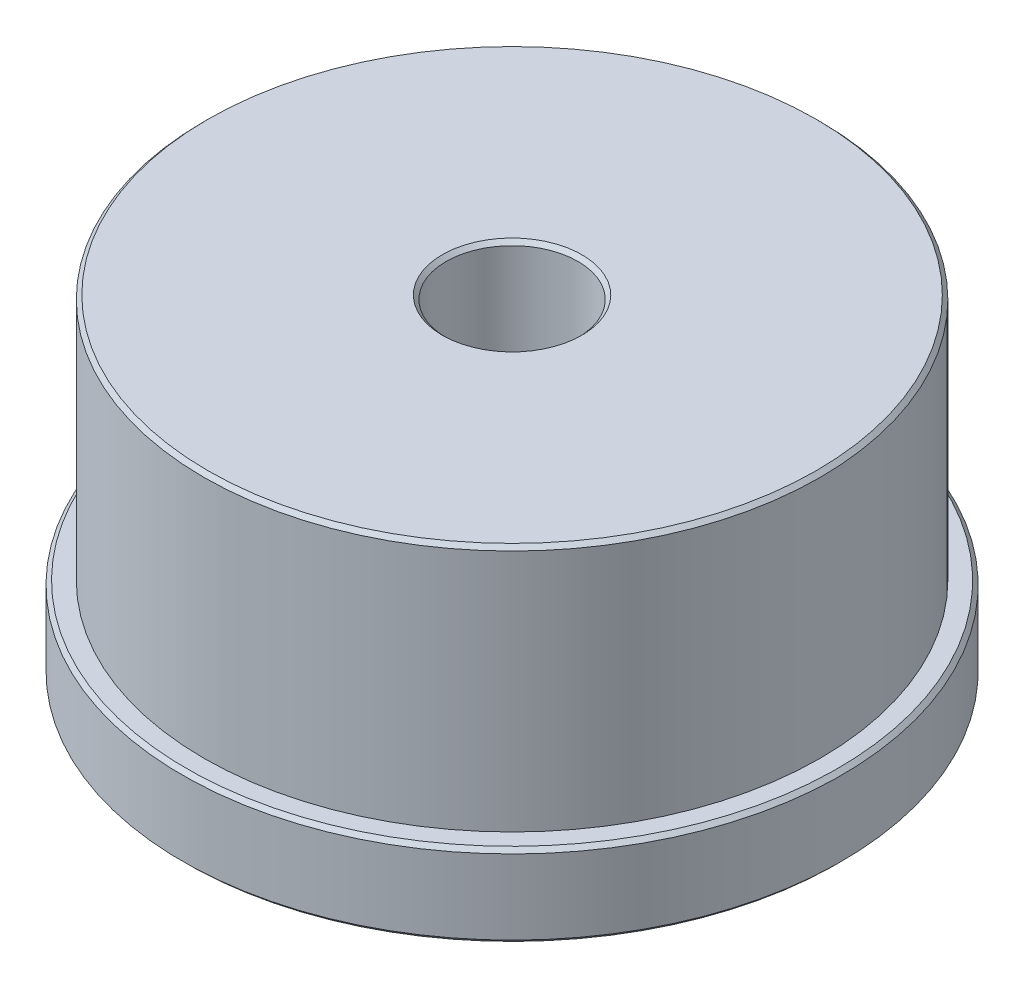
ISO-10303-21;
HEADER;
FILE_DESCRIPTION(('STEP AP214'),'2;1');
FILE_NAME('part.step','',(''),(''),'','','');
FILE_SCHEMA(('AUTOMOTIVE_DESIGN { 1 0 10303 214 1 1 1 1 }'));
ENDSEC;
DATA;
#1=APPLICATION_CONTEXT('core data for automotive mechanical design processes');
#2=APPLICATION_PROTOCOL_DEFINITION('international standard','automotive_design',2000,#1);
#3=PRODUCT_CONTEXT('',#1,'mechanical');
#4=PRODUCT('Part','Part','',(#3));
#5=PRODUCT_RELATED_PRODUCT_CATEGORY('part','',(#4));
#6=PRODUCT_DEFINITION_FORMATION('','',#4);
#7=PRODUCT_DEFINITION_CONTEXT('part definition',#1,'design');
#8=PRODUCT_DEFINITION('design','',#6,#7);
#9=PRODUCT_DEFINITION_SHAPE('','',#8);
#10=(LENGTH_UNIT() NAMED_UNIT(*) SI_UNIT(.MILLI.,.METRE.));
#11=(NAMED_UNIT(*) PLANE_ANGLE_UNIT() SI_UNIT($,.RADIAN.));
#12=(NAMED_UNIT(*) SI_UNIT($,.STERADIAN.) SOLID_ANGLE_UNIT());
#13=UNCERTAINTY_MEASURE_WITH_UNIT(LENGTH_MEASURE(1.E-05),#10,'distance_accuracy_value','');
#14=(GEOMETRIC_REPRESENTATION_CONTEXT(3) GLOBAL_UNCERTAINTY_ASSIGNED_CONTEXT((#13)) GLOBAL_UNIT_ASSIGNED_CONTEXT((#10,
#11,#12)) REPRESENTATION_CONTEXT('',''));
#15=CARTESIAN_POINT('',(0.,0.,0.));
#16=DIRECTION('',(0.,0.,1.));
#17=DIRECTION('',(1.,0.,0.));
#18=AXIS2_PLACEMENT_3D('',#15,#16,#17);
#19=CARTESIAN_POINT('',(0.,19.05,0.));
#20=DIRECTION('',(0.,-1.,0.));
#21=DIRECTION('',(0.,0.,-1.));
#22=AXIS2_PLACEMENT_3D('',#19,#20,#21);
#23=CYLINDRICAL_SURFACE('',#22,5.08);
#24=CARTESIAN_POINT('',(0.,-0.512800091999992,0.));
#25=DIRECTION('',(0.,-1.,0.));
#26=DIRECTION('',(0.,0.,-1.));
#27=AXIS2_PLACEMENT_3D('',#24,#25,#26);
#28=CIRCLE('',#27,5.08);
#29=CARTESIAN_POINT('',(0.,-0.512800091999992,-5.08));
#30=VERTEX_POINT('',#29);
#31=EDGE_CURVE('E76',#30,#30,#28,.T.);
#32=ORIENTED_EDGE('',*,*,#31,.T.);
#33=EDGE_LOOP('',(#32));
#34=FACE_BOUND('',#33,.T.);
#35=CARTESIAN_POINT('',(0.,18.750000092,0.));
#36=DIRECTION('',(0.,1.,0.));
#37=DIRECTION('',(0.,0.,1.));
#38=AXIS2_PLACEMENT_3D('',#35,#36,#37);
#39=CIRCLE('',#38,5.08);
#40=CARTESIAN_POINT('',(0.,18.750000092,5.08));
#41=VERTEX_POINT('',#40);
#42=EDGE_CURVE('E79',#41,#41,#39,.T.);
#43=ORIENTED_EDGE('',*,*,#42,.T.);
#44=EDGE_LOOP('',(#43));
#45=FACE_BOUND('',#44,.T.);
#46=ADVANCED_FACE('F40',(#34,#45),#23,.F.);
#47=CARTESIAN_POINT('',(0.,19.05,0.));
#48=DIRECTION('',(0.,-1.,0.));
#49=DIRECTION('',(0.,0.,-1.));
#50=AXIS2_PLACEMENT_3D('',#47,#48,#49);
#51=CYLINDRICAL_SURFACE('',#50,23.749);
#52=CARTESIAN_POINT('',(0.,18.750000092,0.));
#53=DIRECTION('',(0.,1.,0.));
#54=DIRECTION('',(0.,0.,1.));
#55=AXIS2_PLACEMENT_3D('',#52,#53,#54);
#56=CIRCLE('',#55,23.749);
#57=CARTESIAN_POINT('',(0.,18.750000092,-23.749));
#58=VERTEX_POINT('',#57);
#59=EDGE_CURVE('E10',#58,#58,#56,.F.);
#60=CARTESIAN_POINT('',(0.,0.,0.));
#61=DIRECTION('',(0.,1.,0.));
#62=DIRECTION('',(0.,0.,1.));
#63=AXIS2_PLACEMENT_3D('',#60,#61,#62);
#64=CIRCLE('',#63,23.749);
#65=CARTESIAN_POINT('',(0.,0.,-23.749));
#66=VERTEX_POINT('',#65);
#67=EDGE_CURVE('E85',#66,#66,#64,.T.);
#68=CARTESIAN_POINT('',(0.,18.750000092,-23.749));
#69=CARTESIAN_POINT('',(0.,18.5546875910417,-23.749));
#70=CARTESIAN_POINT('',(0.,18.3593750900834,-23.749));
#71=CARTESIAN_POINT('',(0.,17.9687500881667,-23.749));
#72=CARTESIAN_POINT('',(0.,17.7734375872084,-23.749));
#73=CARTESIAN_POINT('',(0.,17.3828125852917,-23.749));
#74=CARTESIAN_POINT('',(0.,17.1875000843334,-23.749));
#75=CARTESIAN_POINT('',(0.,16.7968750824167,-23.749));
#76=CARTESIAN_POINT('',(0.,16.6015625814584,-23.749));
#77=CARTESIAN_POINT('',(0.,16.2109375795417,-23.749));
#78=CARTESIAN_POINT('',(0.,16.0156250785834,-23.749));
#79=CARTESIAN_POINT('',(0.,15.6250000766667,-23.749));
#80=CARTESIAN_POINT('',(0.,15.4296875757084,-23.749));
#81=CARTESIAN_POINT('',(0.,15.0390625737917,-23.749));
#82=CARTESIAN_POINT('',(0.,14.8437500728334,-23.749));
#83=CARTESIAN_POINT('',(0.,14.4531250709167,-23.749));
#84=CARTESIAN_POINT('',(0.,14.2578125699584,-23.749));
#85=CARTESIAN_POINT('',(0.,13.8671875680417,-23.749));
#86=CARTESIAN_POINT('',(0.,13.6718750670834,-23.749));
#87=CARTESIAN_POINT('',(0.,13.2812500651667,-23.749));
#88=CARTESIAN_POINT('',(0.,13.0859375642084,-23.749));
#89=CARTESIAN_POINT('',(0.,12.6953125622917,-23.749));
#90=CARTESIAN_POINT('',(0.,12.5000000613334,-23.749));
#91=CARTESIAN_POINT('',(0.,12.1093750594167,-23.749));
#92=CARTESIAN_POINT('',(0.,11.9140625584584,-23.749));
#93=CARTESIAN_POINT('',(0.,11.5234375565417,-23.749));
#94=CARTESIAN_POINT('',(0.,11.3281250555834,-23.749));
#95=CARTESIAN_POINT('',(0.,10.9375000536667,-23.749));
#96=CARTESIAN_POINT('',(0.,10.7421875527084,-23.749));
#97=CARTESIAN_POINT('',(0.,10.3515625507917,-23.749));
#98=CARTESIAN_POINT('',(0.,10.1562500498334,-23.749));
#99=CARTESIAN_POINT('',(0.,9.76562504791669,-23.749));
#100=CARTESIAN_POINT('',(0.,9.57031254695835,-23.749));
#101=CARTESIAN_POINT('',(0.,9.17968754504168,-23.749));
#102=CARTESIAN_POINT('',(0.,8.98437504408335,-23.749));
#103=CARTESIAN_POINT('',(0.,8.59375004216668,-23.749));
#104=CARTESIAN_POINT('',(0.,8.39843754120835,-23.749));
#105=CARTESIAN_POINT('',(0.,8.00781253929168,-23.749));
#106=CARTESIAN_POINT('',(0.,7.81250003833335,-23.749));
#107=CARTESIAN_POINT('',(0.,7.42187503641668,-23.749));
#108=CARTESIAN_POINT('',(0.,7.22656253545835,-23.749));
#109=CARTESIAN_POINT('',(0.,6.83593753354168,-23.749));
#110=CARTESIAN_POINT('',(0.,6.64062503258335,-23.749));
#111=CARTESIAN_POINT('',(0.,6.25000003066668,-23.749));
#112=CARTESIAN_POINT('',(0.,6.05468752970834,-23.749));
#113=CARTESIAN_POINT('',(0.,5.66406252779168,-23.749));
#114=CARTESIAN_POINT('',(0.,5.46875002683334,-23.749));
#115=CARTESIAN_POINT('',(0.,5.07812502491667,-23.749));
#116=CARTESIAN_POINT('',(0.,4.88281252395834,-23.749));
#117=CARTESIAN_POINT('',(0.,4.49218752204167,-23.749));
#118=CARTESIAN_POINT('',(0.,4.29687502108334,-23.749));
#119=CARTESIAN_POINT('',(0.,3.90625001916667,-23.749));
#120=CARTESIAN_POINT('',(0.,3.71093751820834,-23.749));
#121=CARTESIAN_POINT('',(0.,3.32031251629167,-23.749));
#122=CARTESIAN_POINT('',(0.,3.12500001533334,-23.749));
#123=CARTESIAN_POINT('',(0.,2.73437501341667,-23.749));
#124=CARTESIAN_POINT('',(0.,2.53906251245834,-23.749));
#125=CARTESIAN_POINT('',(0.,2.14843751054167,-23.749));
#126=CARTESIAN_POINT('',(0.,1.95312500958333,-23.749));
#127=CARTESIAN_POINT('',(0.,1.56250000766667,-23.749));
#128=CARTESIAN_POINT('',(0.,1.36718750670833,-23.749));
#129=CARTESIAN_POINT('',(0.,0.976562504791667,-23.749));
#130=CARTESIAN_POINT('',(0.,0.781250003833334,-23.749));
#131=CARTESIAN_POINT('',(0.,0.390625001916667,-23.749));
#132=CARTESIAN_POINT('',(0.,0.195312500958334,-23.749));
#133=CARTESIAN_POINT('',(0.,0.,-23.749));
#134=B_SPLINE_CURVE_WITH_KNOTS('',3,(#68,#69,#70,#71,#72,#73,#74,#75,#76,#77,#78,#79,#80,#81,
#82,#83,#84,#85,#86,#87,#88,#89,#90,#91,#92,#93,#94,#95,#96,#97,#98,#99,#100,#101,#102,#103,
#104,#105,#106,#107,#108,#109,#110,#111,#112,#113,#114,#115,#116,#117,#118,#119,#120,#121,#122,
#123,#124,#125,#126,#127,#128,#129,#130,#131,#132,#133),.UNSPECIFIED.,.F.,.F.,(4,2,2,2,2,2,2,2,
2,2,2,2,2,2,2,2,2,2,2,2,2,2,2,2,2,2,2,2,2,2,2,2,4),(0.,0.585937502875004,1.17187500575,
1.757812508625,2.34375001150001,2.92968751437501,3.51562501725001,4.10156252012501,
4.68750002300001,5.27343752587501,5.85937502875001,6.44531253162502,7.03125003450002,
7.61718753737502,8.20312504025002,8.78906254312502,9.37500004600002,9.96093754887502,
10.54687505175,11.132812554625,11.7187500575,12.304687560375,12.89062506325,13.476562566125,
14.062500069,14.648437571875,15.23437507475,15.820312577625,16.4062500805,16.992187583375,
17.57812508625,18.164062589125,18.750000092),.UNSPECIFIED.);
#135=EDGE_CURVE('BSEAM111',#58,#66,#134,.T.);
#136=ORIENTED_EDGE('',*,*,#59,.T.);
#137=ORIENTED_EDGE('',*,*,#67,.T.);
#138=ORIENTED_EDGE('',*,*,#135,.T.);
#139=ORIENTED_EDGE('',*,*,#135,.F.);
#140=EDGE_LOOP('',(#136,#138,#137,#139));
#141=FACE_BOUND('',#140,.T.);
#142=ADVANCED_FACE('F111',(#141),#51,.T.);
#143=CARTESIAN_POINT('',(0.,19.05,0.));
#144=DIRECTION('',(0.,1.,0.));
#145=DIRECTION('',(0.,0.,1.));
#146=AXIS2_PLACEMENT_3D('',#143,#144,#145);
#147=PLANE('',#146);
#148=CARTESIAN_POINT('',(0.,19.05,0.));
#149=DIRECTION('',(0.,1.,0.));
#150=DIRECTION('',(0.,0.,1.));
#151=AXIS2_PLACEMENT_3D('',#148,#149,#150);
#152=CIRCLE('',#151,23.449000092);
#153=CARTESIAN_POINT('',(0.,19.05,-23.449000092));
#154=VERTEX_POINT('',#153);
#155=EDGE_CURVE('E48',#154,#154,#152,.T.);
#156=ORIENTED_EDGE('',*,*,#155,.T.);
#157=EDGE_LOOP('',(#156));
#158=FACE_BOUND('',#157,.T.);
#159=CARTESIAN_POINT('',(0.,19.05,0.));
#160=DIRECTION('',(0.,1.,0.));
#161=DIRECTION('',(0.,0.,1.));
#162=AXIS2_PLACEMENT_3D('',#159,#160,#161);
#163=CIRCLE('',#162,5.379999908);
#164=CARTESIAN_POINT('',(0.,19.05,5.379999908));
#165=VERTEX_POINT('',#164);
#166=EDGE_CURVE('E52',#165,#165,#163,.F.);
#167=ORIENTED_EDGE('',*,*,#166,.T.);
#168=EDGE_LOOP('',(#167));
#169=FACE_BOUND('',#168,.T.);
#170=ADVANCED_FACE('F116',(#158,#169),#147,.T.);
#171=CARTESIAN_POINT('',(0.,-6.35,0.));
#172=DIRECTION('',(0.,1.,0.));
#173=DIRECTION('',(0.,0.,1.));
#174=AXIS2_PLACEMENT_3D('',#171,#172,#173);
#175=CYLINDRICAL_SURFACE('',#174,25.4);
#176=CARTESIAN_POINT('',(0.,-0.299999907999997,0.));
#177=DIRECTION('',(0.,-1.,0.));
#178=DIRECTION('',(0.,0.,-1.));
#179=AXIS2_PLACEMENT_3D('',#176,#177,#178);
#180=CIRCLE('',#179,25.4);
#181=CARTESIAN_POINT('',(0.,-0.299999907999997,-25.4));
#182=VERTEX_POINT('',#181);
#183=EDGE_CURVE('E70',#182,#182,#180,.T.);
#184=ORIENTED_EDGE('',*,*,#183,.T.);
#185=EDGE_LOOP('',(#184));
#186=FACE_BOUND('',#185,.T.);
#187=CARTESIAN_POINT('',(0.,-6.050000092,0.));
#188=DIRECTION('',(0.,-1.,0.));
#189=DIRECTION('',(0.,0.,-1.));
#190=AXIS2_PLACEMENT_3D('',#187,#188,#189);
#191=CIRCLE('',#190,25.4);
#192=CARTESIAN_POINT('',(0.,-6.050000092,-25.4));
#193=VERTEX_POINT('',#192);
#194=EDGE_CURVE('E73',#193,#193,#191,.F.);
#195=ORIENTED_EDGE('',*,*,#194,.T.);
#196=EDGE_LOOP('',(#195));
#197=FACE_BOUND('',#196,.T.);
#198=ADVANCED_FACE('F123',(#186,#197),#175,.T.);
#199=CARTESIAN_POINT('',(0.,-6.35,0.));
#200=DIRECTION('',(0.,-1.,0.));
#201=DIRECTION('',(0.,0.,-1.));
#202=AXIS2_PLACEMENT_3D('',#199,#200,#201);
#203=PLANE('',#202);
#204=CARTESIAN_POINT('',(0.,-6.35,0.));
#205=DIRECTION('',(0.,-1.,0.));
#206=DIRECTION('',(0.,0.,-1.));
#207=AXIS2_PLACEMENT_3D('',#204,#205,#206);
#208=CIRCLE('',#207,25.100000092);
#209=CARTESIAN_POINT('',(0.,-6.35,-25.100000092));
#210=VERTEX_POINT('',#209);
#211=EDGE_CURVE('E61',#210,#210,#208,.T.);
#212=ORIENTED_EDGE('',*,*,#211,.T.);
#213=EDGE_LOOP('',(#212));
#214=FACE_BOUND('',#213,.T.);
#215=CARTESIAN_POINT('',(0.,-6.35,0.));
#216=DIRECTION('',(0.,-1.,0.));
#217=DIRECTION('',(0.,0.,-1.));
#218=AXIS2_PLACEMENT_3D('',#215,#216,#217);
#219=CIRCLE('',#218,11.412499908);
#220=CARTESIAN_POINT('',(0.,-6.35,-11.412499908));
#221=VERTEX_POINT('',#220);
#222=EDGE_CURVE('E64',#221,#221,#219,.F.);
#223=ORIENTED_EDGE('',*,*,#222,.T.);
#224=EDGE_LOOP('',(#223));
#225=FACE_BOUND('',#224,.T.);
#226=ADVANCED_FACE('F120',(#214,#225),#203,.T.);
#227=CARTESIAN_POINT('',(0.,0.,0.));
#228=DIRECTION('',(0.,-1.,0.));
#229=DIRECTION('',(0.,0.,-1.));
#230=AXIS2_PLACEMENT_3D('',#227,#228,#229);
#231=PLANE('',#230);
#232=CARTESIAN_POINT('',(0.,0.,0.));
#233=DIRECTION('',(0.,-1.,0.));
#234=DIRECTION('',(0.,0.,-1.));
#235=AXIS2_PLACEMENT_3D('',#232,#233,#234);
#236=CIRCLE('',#235,25.100000092);
#237=CARTESIAN_POINT('',(0.,0.,-25.100000092));
#238=VERTEX_POINT('',#237);
#239=EDGE_CURVE('E67',#238,#238,#236,.F.);
#240=ORIENTED_EDGE('',*,*,#239,.T.);
#241=EDGE_LOOP('',(#240));
#242=FACE_BOUND('',#241,.T.);
#243=ORIENTED_EDGE('',*,*,#67,.F.);
#244=EDGE_LOOP('',(#243));
#245=FACE_BOUND('',#244,.T.);
#246=ADVANCED_FACE('F106',(#242,#245),#231,.F.);
#247=CARTESIAN_POINT('',(0.,-0.8128,0.));
#248=DIRECTION('',(0.,-1.,0.));
#249=DIRECTION('',(0.,0.,-1.));
#250=AXIS2_PLACEMENT_3D('',#247,#248,#249);
#251=PLANE('',#250);
#252=CARTESIAN_POINT('',(0.,-0.8128,0.));
#253=DIRECTION('',(0.,-1.,0.));
#254=DIRECTION('',(0.,0.,-1.));
#255=AXIS2_PLACEMENT_3D('',#252,#253,#254);
#256=CIRCLE('',#255,5.37999990800001);
#257=CARTESIAN_POINT('',(0.,-0.8128,-5.37999990800001));
#258=VERTEX_POINT('',#257);
#259=EDGE_CURVE('E82',#258,#258,#256,.F.);
#260=ORIENTED_EDGE('',*,*,#259,.T.);
#261=EDGE_LOOP('',(#260));
#262=FACE_BOUND('',#261,.T.);
#263=CARTESIAN_POINT('',(0.,-0.8128,0.));
#264=DIRECTION('',(0.,-1.,0.));
#265=DIRECTION('',(0.,0.,-1.));
#266=AXIS2_PLACEMENT_3D('',#263,#264,#265);
#267=CIRCLE('',#266,11.1125);
#268=CARTESIAN_POINT('',(0.,-0.8128,-11.1125));
#269=VERTEX_POINT('',#268);
#270=EDGE_CURVE('E88',#269,#269,#267,.T.);
#271=ORIENTED_EDGE('',*,*,#270,.T.);
#272=EDGE_LOOP('',(#271));
#273=FACE_BOUND('',#272,.T.);
#274=ADVANCED_FACE('F92',(#262,#273),#251,.T.);
#275=CARTESIAN_POINT('',(0.,-0.8128,0.));
#276=DIRECTION('',(0.,-1.,0.));
#277=DIRECTION('',(0.,0.,-1.));
#278=AXIS2_PLACEMENT_3D('',#275,#276,#277);
#279=CYLINDRICAL_SURFACE('',#278,11.1125);
#280=CARTESIAN_POINT('',(0.,-6.05000009199999,0.));
#281=DIRECTION('',(0.,-1.,0.));
#282=DIRECTION('',(0.,0.,-1.));
#283=AXIS2_PLACEMENT_3D('',#280,#281,#282);
#284=CIRCLE('',#283,11.1125);
#285=CARTESIAN_POINT('',(0.,-6.05000009199999,-11.1125));
#286=VERTEX_POINT('',#285);
#287=EDGE_CURVE('E56',#286,#286,#284,.T.);
#288=ORIENTED_EDGE('',*,*,#287,.T.);
#289=EDGE_LOOP('',(#288));
#290=FACE_BOUND('',#289,.T.);
#291=ORIENTED_EDGE('',*,*,#270,.F.);
#292=EDGE_LOOP('',(#291));
#293=FACE_BOUND('',#292,.T.);
#294=ADVANCED_FACE('F94',(#290,#293),#279,.F.);
#295=CARTESIAN_POINT('',(0.,-0.812799999999999,0.));
#296=DIRECTION('',(0.,-1.,0.));
#297=DIRECTION('',(0.,0.,-1.));
#298=AXIS2_PLACEMENT_3D('',#295,#296,#297);
#299=CONICAL_SURFACE('',#298,5.37999990800001,0.785398163397455);
#300=CARTESIAN_POINT('',(0.,-0.512800091999992,-5.08));
#301=CARTESIAN_POINT('',(0.,-0.515925091041659,-5.08312499904167));
#302=CARTESIAN_POINT('',(0.,-0.519050090083325,-5.08624999808333));
#303=CARTESIAN_POINT('',(0.,-0.525300088166659,-5.09249999616667));
#304=CARTESIAN_POINT('',(0.,-0.528425087208325,-5.09562499520833));
#305=CARTESIAN_POINT('',(0.,-0.534675085291659,-5.10187499329167));
#306=CARTESIAN_POINT('',(0.,-0.537800084333326,-5.10499999233333));
#307=CARTESIAN_POINT('',(0.,-0.544050082416659,-5.11124999041667));
#308=CARTESIAN_POINT('',(0.,-0.547175081458326,-5.11437498945834));
#309=CARTESIAN_POINT('',(0.,-0.553425079541659,-5.12062498754167));
#310=CARTESIAN_POINT('',(0.,-0.556550078583326,-5.12374998658334));
#311=CARTESIAN_POINT('',(0.,-0.56280007666666,-5.12999998466667));
#312=CARTESIAN_POINT('',(0.,-0.565925075708326,-5.13312498370834));
#313=CARTESIAN_POINT('',(0.,-0.57217507379166,-5.13937498179167));
#314=CARTESIAN_POINT('',(0.,-0.575300072833327,-5.14249998083334));
#315=CARTESIAN_POINT('',(0.,-0.58155007091666,-5.14874997891667));
#316=CARTESIAN_POINT('',(0.,-0.584675069958327,-5.15187497795834));
#317=CARTESIAN_POINT('',(0.,-0.59092506804166,-5.15812497604167));
#318=CARTESIAN_POINT('',(0.,-0.594050067083327,-5.16124997508334));
#319=CARTESIAN_POINT('',(0.,-0.600300065166661,-5.16749997316667));
#320=CARTESIAN_POINT('',(0.,-0.603425064208327,-5.17062497220834));
#321=CARTESIAN_POINT('',(0.,-0.609675062291661,-5.17687497029167));
#322=CARTESIAN_POINT('',(0.,-0.612800061333328,-5.17999996933334));
#323=CARTESIAN_POINT('',(0.,-0.619050059416661,-5.18624996741667));
#324=CARTESIAN_POINT('',(0.,-0.622175058458328,-5.18937496645834));
#325=CARTESIAN_POINT('',(0.,-0.628425056541661,-5.19562496454167));
#326=CARTESIAN_POINT('',(0.,-0.631550055583328,-5.19874996358334));
#327=CARTESIAN_POINT('',(0.,-0.637800053666662,-5.20499996166667));
#328=CARTESIAN_POINT('',(0.,-0.640925052708329,-5.20812496070834));
#329=CARTESIAN_POINT('',(0.,-0.647175050791662,-5.21437495879167));
#330=CARTESIAN_POINT('',(0.,-0.650300049833329,-5.21749995783334));
#331=CARTESIAN_POINT('',(0.,-0.656550047916662,-5.22374995591667));
#332=CARTESIAN_POINT('',(0.,-0.659675046958329,-5.22687495495834));
#333=CARTESIAN_POINT('',(0.,-0.665925045041663,-5.23312495304167));
#334=CARTESIAN_POINT('',(0.,-0.669050044083329,-5.23624995208334));
#335=CARTESIAN_POINT('',(0.,-0.675300042166663,-5.24249995016667));
#336=CARTESIAN_POINT('',(0.,-0.678425041208329,-5.24562494920834));
#337=CARTESIAN_POINT('',(0.,-0.684675039291663,-5.25187494729167));
#338=CARTESIAN_POINT('',(0.,-0.68780003833333,-5.25499994633334));
#339=CARTESIAN_POINT('',(0.,-0.694050036416663,-5.26124994441667));
#340=CARTESIAN_POINT('',(0.,-0.69717503545833,-5.26437494345834));
#341=CARTESIAN_POINT('',(0.,-0.703425033541663,-5.27062494154167));
#342=CARTESIAN_POINT('',(0.,-0.70655003258333,-5.27374994058334));
#343=CARTESIAN_POINT('',(0.,-0.712800030666664,-5.27999993866668));
#344=CARTESIAN_POINT('',(0.,-0.71592502970833,-5.28312493770834));
#345=CARTESIAN_POINT('',(0.,-0.722175027791664,-5.28937493579168));
#346=CARTESIAN_POINT('',(0.,-0.725300026833331,-5.29249993483334));
#347=CARTESIAN_POINT('',(0.,-0.731550024916664,-5.29874993291668));
#348=CARTESIAN_POINT('',(0.,-0.734675023958331,-5.30187493195834));
#349=CARTESIAN_POINT('',(0.,-0.740925022041665,-5.30812493004168));
#350=CARTESIAN_POINT('',(0.,-0.744050021083331,-5.31124992908334));
#351=CARTESIAN_POINT('',(0.,-0.750300019166665,-5.31749992716668));
#352=CARTESIAN_POINT('',(0.,-0.753425018208332,-5.32062492620834));
#353=CARTESIAN_POINT('',(0.,-0.759675016291665,-5.32687492429168));
#354=CARTESIAN_POINT('',(0.,-0.762800015333332,-5.32999992333334));
#355=CARTESIAN_POINT('',(0.,-0.769050013416665,-5.33624992141668));
#356=CARTESIAN_POINT('',(0.,-0.772175012458332,-5.33937492045834));
#357=CARTESIAN_POINT('',(0.,-0.778425010541665,-5.34562491854168));
#358=CARTESIAN_POINT('',(0.,-0.781550009583332,-5.34874991758335));
#359=CARTESIAN_POINT('',(0.,-0.787800007666666,-5.35499991566668));
#360=CARTESIAN_POINT('',(0.,-0.790925006708333,-5.35812491470835));
#361=CARTESIAN_POINT('',(0.,-0.797175004791666,-5.36437491279168));
#362=CARTESIAN_POINT('',(0.,-0.800300003833333,-5.36749991183335));
#363=CARTESIAN_POINT('',(0.,-0.806550001916666,-5.37374990991668));
#364=CARTESIAN_POINT('',(0.,-0.809675000958333,-5.37687490895835));
#365=CARTESIAN_POINT('',(0.,-0.8128,-5.37999990800001));
#366=B_SPLINE_CURVE_WITH_KNOTS('',3,(#300,#301,#302,#303,#304,#305,#306,#307,#308,#309,#310,
#311,#312,#313,#314,#315,#316,#317,#318,#319,#320,#321,#322,#323,#324,#325,#326,#327,#328,#329,
#330,#331,#332,#333,#334,#335,#336,#337,#338,#339,#340,#341,#342,#343,#344,#345,#346,#347,#348,
#349,#350,#351,#352,#353,#354,#355,#356,#357,#358,#359,#360,#361,#362,#363,#364,#365),
.UNSPECIFIED.,.F.,.F.,(4,2,2,2,2,2,2,2,2,2,2,2,2,2,2,2,2,2,2,2,2,2,2,2,2,2,2,2,2,2,2,2,4),(0.,
0.013258248081384,0.0265164961627686,0.0397747442441527,0.0530329923255367,0.0662912404069208,
0.0795494884883054,0.0928077365696894,0.106065984651073,0.119324232732458,0.132582480813842,
0.145840728895226,0.159098976976611,0.172357225057995,0.185615473139379,0.198873721220764,
0.212131969302148,0.225390217383532,0.238648465464916,0.2519067135463,0.265164961627684,
0.278423209709068,0.291681457790453,0.304939705871837,0.318197953953221,0.331456202034606,
0.34471445011599,0.357972698197374,0.371230946278759,0.384489194360143,0.397747442441527,
0.411005690522911,0.424263938604295),.UNSPECIFIED.);
#367=EDGE_CURVE('BSEAM96',#30,#258,#366,.T.);
#368=ORIENTED_EDGE('',*,*,#31,.F.);
#369=ORIENTED_EDGE('',*,*,#259,.F.);
#370=ORIENTED_EDGE('',*,*,#367,.T.);
#371=ORIENTED_EDGE('',*,*,#367,.F.);
#372=EDGE_LOOP('',(#368,#370,#369,#371));
#373=FACE_BOUND('',#372,.T.);
#374=ADVANCED_FACE('F96',(#373),#299,.F.);
#375=CARTESIAN_POINT('',(0.,-0.299999907999997,0.));
#376=DIRECTION('',(0.,-1.,0.));
#377=DIRECTION('',(0.,0.,-1.));
#378=AXIS2_PLACEMENT_3D('',#375,#376,#377);
#379=CONICAL_SURFACE('',#378,25.4,0.785398163397448);
#380=ORIENTED_EDGE('',*,*,#239,.F.);
#381=EDGE_LOOP('',(#380));
#382=FACE_BOUND('',#381,.T.);
#383=ORIENTED_EDGE('',*,*,#183,.F.);
#384=EDGE_LOOP('',(#383));
#385=FACE_BOUND('',#384,.T.);
#386=ADVANCED_FACE('F103',(#382,#385),#379,.T.);
#387=CARTESIAN_POINT('',(0.,-6.35,0.));
#388=DIRECTION('',(0.,1.,0.));
#389=DIRECTION('',(0.,0.,1.));
#390=AXIS2_PLACEMENT_3D('',#387,#388,#389);
#391=CONICAL_SURFACE('',#390,25.100000092,0.785398163397443);
#392=ORIENTED_EDGE('',*,*,#194,.F.);
#393=EDGE_LOOP('',(#392));
#394=FACE_BOUND('',#393,.T.);
#395=ORIENTED_EDGE('',*,*,#211,.F.);
#396=EDGE_LOOP('',(#395));
#397=FACE_BOUND('',#396,.T.);
#398=ADVANCED_FACE('F142',(#394,#397),#391,.T.);
#399=CARTESIAN_POINT('',(0.,-6.05000009199999,0.));
#400=DIRECTION('',(0.,-1.,0.));
#401=DIRECTION('',(0.,0.,-1.));
#402=AXIS2_PLACEMENT_3D('',#399,#400,#401);
#403=CONICAL_SURFACE('',#402,11.1125,0.785398163397443);
#404=ORIENTED_EDGE('',*,*,#222,.F.);
#405=EDGE_LOOP('',(#404));
#406=FACE_BOUND('',#405,.T.);
#407=ORIENTED_EDGE('',*,*,#287,.F.);
#408=EDGE_LOOP('',(#407));
#409=FACE_BOUND('',#408,.T.);
#410=ADVANCED_FACE('F149',(#406,#409),#403,.F.);
#411=CARTESIAN_POINT('',(0.,19.05,0.));
#412=DIRECTION('',(0.,-1.,0.));
#413=DIRECTION('',(0.,0.,-1.));
#414=AXIS2_PLACEMENT_3D('',#411,#412,#413);
#415=CONICAL_SURFACE('',#414,23.449000092,0.785398163397437);
#416=CARTESIAN_POINT('',(0.,18.750000092,-23.749));
#417=CARTESIAN_POINT('',(0.,18.7531250910417,-23.7458750009583));
#418=CARTESIAN_POINT('',(0.,18.7562500900834,-23.7427500019167));
#419=CARTESIAN_POINT('',(0.,18.7625000881667,-23.7365000038333));
#420=CARTESIAN_POINT('',(0.,18.7656250872084,-23.7333750047917));
#421=CARTESIAN_POINT('',(0.,18.7718750852917,-23.7271250067083));
#422=CARTESIAN_POINT('',(0.,18.7750000843334,-23.7240000076667));
#423=CARTESIAN_POINT('',(0.,18.7812500824167,-23.7177500095833));
#424=CARTESIAN_POINT('',(0.,18.7843750814584,-23.7146250105417));
#425=CARTESIAN_POINT('',(0.,18.7906250795417,-23.7083750124583));
#426=CARTESIAN_POINT('',(0.,18.7937500785834,-23.7052500134167));
#427=CARTESIAN_POINT('',(0.,18.8000000766667,-23.6990000153333));
#428=CARTESIAN_POINT('',(0.,18.8031250757084,-23.6958750162917));
#429=CARTESIAN_POINT('',(0.,18.8093750737917,-23.6896250182083));
#430=CARTESIAN_POINT('',(0.,18.8125000728334,-23.6865000191667));
#431=CARTESIAN_POINT('',(0.,18.8187500709167,-23.6802500210833));
#432=CARTESIAN_POINT('',(0.,18.8218750699584,-23.6771250220417));
#433=CARTESIAN_POINT('',(0.,18.8281250680417,-23.6708750239583));
#434=CARTESIAN_POINT('',(0.,18.8312500670834,-23.6677500249167));
#435=CARTESIAN_POINT('',(0.,18.8375000651667,-23.6615000268334));
#436=CARTESIAN_POINT('',(0.,18.8406250642084,-23.6583750277917));
#437=CARTESIAN_POINT('',(0.,18.8468750622917,-23.6521250297084));
#438=CARTESIAN_POINT('',(0.,18.8500000613334,-23.6490000306667));
#439=CARTESIAN_POINT('',(0.,18.8562500594167,-23.6427500325834));
#440=CARTESIAN_POINT('',(0.,18.8593750584584,-23.6396250335417));
#441=CARTESIAN_POINT('',(0.,18.8656250565417,-23.6333750354584));
#442=CARTESIAN_POINT('',(0.,18.8687500555834,-23.6302500364167));
#443=CARTESIAN_POINT('',(0.,18.8750000536667,-23.6240000383334));
#444=CARTESIAN_POINT('',(0.,18.8781250527084,-23.6208750392917));
#445=CARTESIAN_POINT('',(0.,18.8843750507917,-23.6146250412084));
#446=CARTESIAN_POINT('',(0.,18.8875000498334,-23.6115000421667));
#447=CARTESIAN_POINT('',(0.,18.8937500479167,-23.6052500440834));
#448=CARTESIAN_POINT('',(0.,18.8968750469584,-23.6021250450417));
#449=CARTESIAN_POINT('',(0.,18.9031250450417,-23.5958750469584));
#450=CARTESIAN_POINT('',(0.,18.9062500440834,-23.5927500479167));
#451=CARTESIAN_POINT('',(0.,18.9125000421667,-23.5865000498334));
#452=CARTESIAN_POINT('',(0.,18.9156250412084,-23.5833750507917));
#453=CARTESIAN_POINT('',(0.,18.9218750392917,-23.5771250527084));
#454=CARTESIAN_POINT('',(0.,18.9250000383333,-23.5740000536667));
#455=CARTESIAN_POINT('',(0.,18.9312500364167,-23.5677500555834));
#456=CARTESIAN_POINT('',(0.,18.9343750354583,-23.5646250565417));
#457=CARTESIAN_POINT('',(0.,18.9406250335417,-23.5583750584584));
#458=CARTESIAN_POINT('',(0.,18.9437500325833,-23.5552500594167));
#459=CARTESIAN_POINT('',(0.,18.9500000306667,-23.5490000613334));
#460=CARTESIAN_POINT('',(0.,18.9531250297083,-23.5458750622917));
#461=CARTESIAN_POINT('',(0.,18.9593750277917,-23.5396250642084));
#462=CARTESIAN_POINT('',(0.,18.9625000268333,-23.5365000651667));
#463=CARTESIAN_POINT('',(0.,18.9687500249167,-23.5302500670834));
#464=CARTESIAN_POINT('',(0.,18.9718750239583,-23.5271250680417));
#465=CARTESIAN_POINT('',(0.,18.9781250220417,-23.5208750699584));
#466=CARTESIAN_POINT('',(0.,18.9812500210833,-23.5177500709167));
#467=CARTESIAN_POINT('',(0.,18.9875000191667,-23.5115000728334));
#468=CARTESIAN_POINT('',(0.,18.9906250182083,-23.5083750737917));
#469=CARTESIAN_POINT('',(0.,18.9968750162917,-23.5021250757084));
#470=CARTESIAN_POINT('',(0.,19.0000000153333,-23.4990000766667));
#471=CARTESIAN_POINT('',(0.,19.0062500134167,-23.4927500785834));
#472=CARTESIAN_POINT('',(0.,19.0093750124583,-23.4896250795417));
#473=CARTESIAN_POINT('',(0.,19.0156250105417,-23.4833750814584));
#474=CARTESIAN_POINT('',(0.,19.0187500095833,-23.4802500824167));
#475=CARTESIAN_POINT('',(0.,19.0250000076667,-23.4740000843334));
#476=CARTESIAN_POINT('',(0.,19.0281250067083,-23.4708750852917));
#477=CARTESIAN_POINT('',(0.,19.0343750047917,-23.4646250872084));
#478=CARTESIAN_POINT('',(0.,19.0375000038333,-23.4615000881667));
#479=CARTESIAN_POINT('',(0.,19.0437500019167,-23.4552500900834));
#480=CARTESIAN_POINT('',(0.,19.0468750009583,-23.4521250910417));
#481=CARTESIAN_POINT('',(0.,19.05,-23.449000092));
#482=B_SPLINE_CURVE_WITH_KNOTS('',3,(#416,#417,#418,#419,#420,#421,#422,#423,#424,#425,#426,
#427,#428,#429,#430,#431,#432,#433,#434,#435,#436,#437,#438,#439,#440,#441,#442,#443,#444,#445,
#446,#447,#448,#449,#450,#451,#452,#453,#454,#455,#456,#457,#458,#459,#460,#461,#462,#463,#464,
#465,#466,#467,#468,#469,#470,#471,#472,#473,#474,#475,#476,#477,#478,#479,#480,#481),
.UNSPECIFIED.,.F.,.F.,(4,2,2,2,2,2,2,2,2,2,2,2,2,2,2,2,2,2,2,2,2,2,2,2,2,2,2,2,2,2,2,2,4),(0.,
0.0132582480813815,0.0265164961627654,0.0397747442441445,0.0530329923255284,0.0662912404069099,
0.0795494884882914,0.0928077365696729,0.106065984651057,0.119324232732438,0.13258248081382,
0.145840728895201,0.159098976976583,0.172357225057967,0.185615473139346,0.19887372122073,
0.212131969302114,0.225390217383493,0.238648465464877,0.251906713546256,0.265164961627639,
0.278423209709021,0.291681457790402,0.304939705871784,0.318197953953168,0.331456202034549,
0.344714450115931,0.357972698197312,0.371230946278694,0.384489194360078,0.397747442441457,
0.411005690522841,0.424263938604225),.UNSPECIFIED.);
#483=EDGE_CURVE('BSEAM155',#58,#154,#482,.T.);
#484=ORIENTED_EDGE('',*,*,#59,.F.);
#485=ORIENTED_EDGE('',*,*,#155,.F.);
#486=ORIENTED_EDGE('',*,*,#483,.T.);
#487=ORIENTED_EDGE('',*,*,#483,.F.);
#488=EDGE_LOOP('',(#484,#486,#485,#487));
#489=FACE_BOUND('',#488,.T.);
#490=ADVANCED_FACE('F155',(#489),#415,.T.);
#491=CARTESIAN_POINT('',(0.,19.05,0.));
#492=DIRECTION('',(0.,1.,0.));
#493=DIRECTION('',(0.,0.,1.));
#494=AXIS2_PLACEMENT_3D('',#491,#492,#493);
#495=CONICAL_SURFACE('',#494,5.379999908,0.785398163397444);
#496=ORIENTED_EDGE('',*,*,#42,.F.);
#497=EDGE_LOOP('',(#496));
#498=FACE_BOUND('',#497,.T.);
#499=ORIENTED_EDGE('',*,*,#166,.F.);
#500=EDGE_LOOP('',(#499));
#501=FACE_BOUND('',#500,.T.);
#502=ADVANCED_FACE('F43',(#498,#501),#495,.F.);
#503=CLOSED_SHELL('',(#46,#142,#170,#198,#226,#246,#274,#294,#374,#386,#398,#410,#490,#502));
#504=MANIFOLD_SOLID_BREP('B2',#503);
#505=ADVANCED_BREP_SHAPE_REPRESENTATION('',(#18,#504),#14);
#506=SHAPE_DEFINITION_REPRESENTATION(#9,#505);
ENDSEC;
END-ISO-10303-21;
